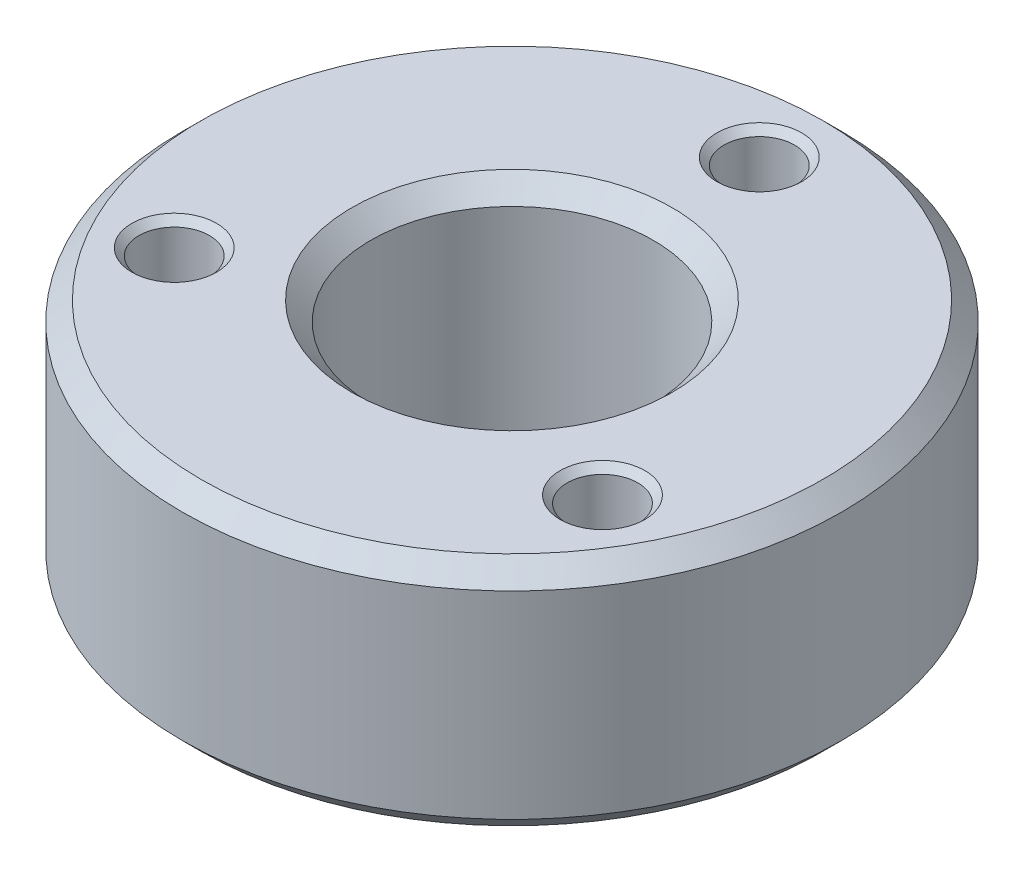
ISO-10303-21;
HEADER;
FILE_DESCRIPTION(('STEP AP214'),'2;1');
FILE_NAME('part.step','',(''),(''),'','','');
FILE_SCHEMA(('AUTOMOTIVE_DESIGN { 1 0 10303 214 1 1 1 1 }'));
ENDSEC;
DATA;
#1=APPLICATION_CONTEXT('core data for automotive mechanical design processes');
#2=APPLICATION_PROTOCOL_DEFINITION('international standard','automotive_design',2000,#1);
#3=PRODUCT_CONTEXT('',#1,'mechanical');
#4=PRODUCT('Part','Part','',(#3));
#5=PRODUCT_RELATED_PRODUCT_CATEGORY('part','',(#4));
#6=PRODUCT_DEFINITION_FORMATION('','',#4);
#7=PRODUCT_DEFINITION_CONTEXT('part definition',#1,'design');
#8=PRODUCT_DEFINITION('design','',#6,#7);
#9=PRODUCT_DEFINITION_SHAPE('','',#8);
#10=(LENGTH_UNIT() NAMED_UNIT(*) SI_UNIT(.MILLI.,.METRE.));
#11=(NAMED_UNIT(*) PLANE_ANGLE_UNIT() SI_UNIT($,.RADIAN.));
#12=(NAMED_UNIT(*) SI_UNIT($,.STERADIAN.) SOLID_ANGLE_UNIT());
#13=UNCERTAINTY_MEASURE_WITH_UNIT(LENGTH_MEASURE(1.E-05),#10,'distance_accuracy_value','');
#14=(GEOMETRIC_REPRESENTATION_CONTEXT(3) GLOBAL_UNCERTAINTY_ASSIGNED_CONTEXT((#13)) GLOBAL_UNIT_ASSIGNED_CONTEXT((#10,
#11,#12)) REPRESENTATION_CONTEXT('',''));
#15=CARTESIAN_POINT('',(0.,0.,0.));
#16=DIRECTION('',(0.,0.,1.));
#17=DIRECTION('',(1.,0.,0.));
#18=AXIS2_PLACEMENT_3D('',#15,#16,#17);
#19=CARTESIAN_POINT('',(0.,10.,0.));
#20=DIRECTION('',(0.,-1.,0.));
#21=DIRECTION('',(0.,0.,-1.));
#22=AXIS2_PLACEMENT_3D('',#19,#20,#21);
#23=CYLINDRICAL_SURFACE('',#22,14.);
#24=CARTESIAN_POINT('',(0.,0.800000000000006,0.));
#25=DIRECTION('',(0.,1.,0.));
#26=DIRECTION('',(0.,0.,1.));
#27=AXIS2_PLACEMENT_3D('',#24,#25,#26);
#28=CIRCLE('',#27,14.);
#29=CARTESIAN_POINT('',(0.,0.800000000000006,14.));
#30=VERTEX_POINT('',#29);
#31=EDGE_CURVE('E123',#30,#30,#28,.T.);
#32=ORIENTED_EDGE('',*,*,#31,.T.);
#33=EDGE_LOOP('',(#32));
#34=FACE_BOUND('',#33,.T.);
#35=CARTESIAN_POINT('',(0.,9.19999999999999,0.));
#36=DIRECTION('',(0.,1.,0.));
#37=DIRECTION('',(0.,0.,1.));
#38=AXIS2_PLACEMENT_3D('',#35,#36,#37);
#39=CIRCLE('',#38,14.);
#40=CARTESIAN_POINT('',(0.,9.19999999999999,14.));
#41=VERTEX_POINT('',#40);
#42=EDGE_CURVE('E127',#41,#41,#39,.F.);
#43=ORIENTED_EDGE('',*,*,#42,.T.);
#44=EDGE_LOOP('',(#43));
#45=FACE_BOUND('',#44,.T.);
#46=ADVANCED_FACE('F42',(#34,#45),#23,.T.);
#47=CARTESIAN_POINT('',(0.,10.,0.));
#48=DIRECTION('',(0.,1.,0.));
#49=DIRECTION('',(0.,0.,1.));
#50=AXIS2_PLACEMENT_3D('',#47,#48,#49);
#51=PLANE('',#50);
#52=CARTESIAN_POINT('',(-9.09326673973665,10.,5.24999999999992));
#53=DIRECTION('',(0.,1.,0.));
#54=DIRECTION('',(0.,0.,1.));
#55=AXIS2_PLACEMENT_3D('',#52,#53,#54);
#56=CIRCLE('',#55,1.79999999999999);
#57=CARTESIAN_POINT('',(-9.09326673973665,10.,7.04999999999991));
#58=VERTEX_POINT('',#57);
#59=EDGE_CURVE('E10',#58,#58,#56,.F.);
#60=ORIENTED_EDGE('',*,*,#59,.T.);
#61=EDGE_LOOP('',(#60));
#62=FACE_BOUND('',#61,.T.);
#63=CARTESIAN_POINT('',(9.09326673973658,10.,5.25000000000004));
#64=DIRECTION('',(0.,1.,0.));
#65=DIRECTION('',(0.,0.,1.));
#66=AXIS2_PLACEMENT_3D('',#63,#64,#65);
#67=CIRCLE('',#66,1.79999999999999);
#68=CARTESIAN_POINT('',(9.09326673973658,10.,7.05000000000003));
#69=VERTEX_POINT('',#68);
#70=EDGE_CURVE('E67',#69,#69,#67,.F.);
#71=ORIENTED_EDGE('',*,*,#70,.T.);
#72=EDGE_LOOP('',(#71));
#73=FACE_BOUND('',#72,.T.);
#74=CARTESIAN_POINT('',(0.,10.,-10.5));
#75=DIRECTION('',(0.,1.,0.));
#76=DIRECTION('',(0.,0.,1.));
#77=AXIS2_PLACEMENT_3D('',#74,#75,#76);
#78=CIRCLE('',#77,1.8);
#79=CARTESIAN_POINT('',(0.,10.,-8.7));
#80=VERTEX_POINT('',#79);
#81=EDGE_CURVE('E83',#80,#80,#78,.F.);
#82=ORIENTED_EDGE('',*,*,#81,.T.);
#83=EDGE_LOOP('',(#82));
#84=FACE_BOUND('',#83,.T.);
#85=CARTESIAN_POINT('',(0.,10.,0.));
#86=DIRECTION('',(0.,1.,0.));
#87=DIRECTION('',(0.,0.,1.));
#88=AXIS2_PLACEMENT_3D('',#85,#86,#87);
#89=CIRCLE('',#88,13.2);
#90=CARTESIAN_POINT('',(0.,10.,13.2));
#91=VERTEX_POINT('',#90);
#92=EDGE_CURVE('E99',#91,#91,#89,.T.);
#93=ORIENTED_EDGE('',*,*,#92,.T.);
#94=EDGE_LOOP('',(#93));
#95=FACE_BOUND('',#94,.T.);
#96=CARTESIAN_POINT('',(0.,10.,0.));
#97=DIRECTION('',(0.,1.,0.));
#98=DIRECTION('',(0.,0.,1.));
#99=AXIS2_PLACEMENT_3D('',#96,#97,#98);
#100=CIRCLE('',#99,6.8);
#101=CARTESIAN_POINT('',(0.,10.,6.8));
#102=VERTEX_POINT('',#101);
#103=EDGE_CURVE('E103',#102,#102,#100,.F.);
#104=ORIENTED_EDGE('',*,*,#103,.T.);
#105=EDGE_LOOP('',(#104));
#106=FACE_BOUND('',#105,.T.);
#107=ADVANCED_FACE('F141',(#62,#73,#84,#95,#106),#51,.T.);
#108=CARTESIAN_POINT('',(0.,0.,0.));
#109=DIRECTION('',(0.,1.,0.));
#110=DIRECTION('',(0.,0.,1.));
#111=AXIS2_PLACEMENT_3D('',#108,#109,#110);
#112=PLANE('',#111);
#113=CARTESIAN_POINT('',(-9.09326673973665,0.,5.24999999999992));
#114=DIRECTION('',(0.,1.,0.));
#115=DIRECTION('',(0.,0.,1.));
#116=AXIS2_PLACEMENT_3D('',#113,#114,#115);
#117=CIRCLE('',#116,1.8);
#118=CARTESIAN_POINT('',(-9.09326673973665,0.,7.04999999999992));
#119=VERTEX_POINT('',#118);
#120=EDGE_CURVE('E61',#119,#119,#117,.T.);
#121=ORIENTED_EDGE('',*,*,#120,.T.);
#122=EDGE_LOOP('',(#121));
#123=FACE_BOUND('',#122,.T.);
#124=CARTESIAN_POINT('',(9.09326673973658,0.,5.25000000000004));
#125=DIRECTION('',(0.,1.,0.));
#126=DIRECTION('',(0.,0.,1.));
#127=AXIS2_PLACEMENT_3D('',#124,#125,#126);
#128=CIRCLE('',#127,1.8);
#129=CARTESIAN_POINT('',(9.09326673973658,0.,7.05000000000004));
#130=VERTEX_POINT('',#129);
#131=EDGE_CURVE('E79',#130,#130,#128,.T.);
#132=ORIENTED_EDGE('',*,*,#131,.T.);
#133=EDGE_LOOP('',(#132));
#134=FACE_BOUND('',#133,.T.);
#135=CARTESIAN_POINT('',(0.,0.,-10.5));
#136=DIRECTION('',(0.,1.,0.));
#137=DIRECTION('',(0.,0.,1.));
#138=AXIS2_PLACEMENT_3D('',#135,#136,#137);
#139=CIRCLE('',#138,1.8);
#140=CARTESIAN_POINT('',(0.,0.,-8.7));
#141=VERTEX_POINT('',#140);
#142=EDGE_CURVE('E95',#141,#141,#139,.T.);
#143=ORIENTED_EDGE('',*,*,#142,.T.);
#144=EDGE_LOOP('',(#143));
#145=FACE_BOUND('',#144,.T.);
#146=CARTESIAN_POINT('',(0.,0.,0.));
#147=DIRECTION('',(0.,1.,0.));
#148=DIRECTION('',(0.,0.,1.));
#149=AXIS2_PLACEMENT_3D('',#146,#147,#148);
#150=CIRCLE('',#149,13.2);
#151=CARTESIAN_POINT('',(0.,0.,13.2));
#152=VERTEX_POINT('',#151);
#153=EDGE_CURVE('E115',#152,#152,#150,.F.);
#154=ORIENTED_EDGE('',*,*,#153,.T.);
#155=EDGE_LOOP('',(#154));
#156=FACE_BOUND('',#155,.T.);
#157=CARTESIAN_POINT('',(0.,0.,0.));
#158=DIRECTION('',(0.,1.,0.));
#159=DIRECTION('',(0.,0.,1.));
#160=AXIS2_PLACEMENT_3D('',#157,#158,#159);
#161=CIRCLE('',#160,6.8);
#162=CARTESIAN_POINT('',(0.,0.,6.8));
#163=VERTEX_POINT('',#162);
#164=EDGE_CURVE('E119',#163,#163,#161,.T.);
#165=ORIENTED_EDGE('',*,*,#164,.T.);
#166=EDGE_LOOP('',(#165));
#167=FACE_BOUND('',#166,.T.);
#168=ADVANCED_FACE('F144',(#123,#134,#145,#156,#167),#112,.F.);
#169=CARTESIAN_POINT('',(0.,0.,0.));
#170=DIRECTION('',(0.,1.,0.));
#171=DIRECTION('',(0.,0.,1.));
#172=AXIS2_PLACEMENT_3D('',#169,#170,#171);
#173=CYLINDRICAL_SURFACE('',#172,6.);
#174=CARTESIAN_POINT('',(0.,0.799999999999992,0.));
#175=DIRECTION('',(0.,1.,0.));
#176=DIRECTION('',(0.,0.,1.));
#177=AXIS2_PLACEMENT_3D('',#174,#175,#176);
#178=CIRCLE('',#177,6.);
#179=CARTESIAN_POINT('',(0.,0.799999999999992,6.));
#180=VERTEX_POINT('',#179);
#181=EDGE_CURVE('E107',#180,#180,#178,.F.);
#182=ORIENTED_EDGE('',*,*,#181,.T.);
#183=EDGE_LOOP('',(#182));
#184=FACE_BOUND('',#183,.T.);
#185=CARTESIAN_POINT('',(0.,9.19999999999999,0.));
#186=DIRECTION('',(0.,1.,0.));
#187=DIRECTION('',(0.,0.,1.));
#188=AXIS2_PLACEMENT_3D('',#185,#186,#187);
#189=CIRCLE('',#188,6.);
#190=CARTESIAN_POINT('',(0.,9.19999999999999,6.));
#191=VERTEX_POINT('',#190);
#192=EDGE_CURVE('E111',#191,#191,#189,.T.);
#193=ORIENTED_EDGE('',*,*,#192,.T.);
#194=EDGE_LOOP('',(#193));
#195=FACE_BOUND('',#194,.T.);
#196=ADVANCED_FACE('F154',(#184,#195),#173,.F.);
#197=CARTESIAN_POINT('',(0.,0.,-10.5));
#198=DIRECTION('',(0.,1.,0.));
#199=DIRECTION('',(0.,0.,1.));
#200=AXIS2_PLACEMENT_3D('',#197,#198,#199);
#201=CYLINDRICAL_SURFACE('',#200,1.5);
#202=CARTESIAN_POINT('',(0.,0.299999999999999,-10.5));
#203=DIRECTION('',(0.,1.,0.));
#204=DIRECTION('',(0.,0.,1.));
#205=AXIS2_PLACEMENT_3D('',#202,#203,#204);
#206=CIRCLE('',#205,1.5);
#207=CARTESIAN_POINT('',(0.,0.299999999999999,-9.));
#208=VERTEX_POINT('',#207);
#209=EDGE_CURVE('E87',#208,#208,#206,.F.);
#210=ORIENTED_EDGE('',*,*,#209,.T.);
#211=EDGE_LOOP('',(#210));
#212=FACE_BOUND('',#211,.T.);
#213=CARTESIAN_POINT('',(0.,9.7,-10.5));
#214=DIRECTION('',(0.,1.,0.));
#215=DIRECTION('',(0.,0.,1.));
#216=AXIS2_PLACEMENT_3D('',#213,#214,#215);
#217=CIRCLE('',#216,1.5);
#218=CARTESIAN_POINT('',(0.,9.7,-9.));
#219=VERTEX_POINT('',#218);
#220=EDGE_CURVE('E91',#219,#219,#217,.T.);
#221=ORIENTED_EDGE('',*,*,#220,.T.);
#222=EDGE_LOOP('',(#221));
#223=FACE_BOUND('',#222,.T.);
#224=ADVANCED_FACE('F156',(#212,#223),#201,.F.);
#225=CARTESIAN_POINT('',(0.,0.800000000000006,0.));
#226=DIRECTION('',(0.,1.,0.));
#227=DIRECTION('',(0.,0.,1.));
#228=AXIS2_PLACEMENT_3D('',#225,#226,#227);
#229=CONICAL_SURFACE('',#228,14.,0.785398163397448);
#230=ORIENTED_EDGE('',*,*,#153,.F.);
#231=EDGE_LOOP('',(#230));
#232=FACE_BOUND('',#231,.T.);
#233=ORIENTED_EDGE('',*,*,#31,.F.);
#234=EDGE_LOOP('',(#233));
#235=FACE_BOUND('',#234,.T.);
#236=ADVANCED_FACE('F163',(#232,#235),#229,.T.);
#237=CARTESIAN_POINT('',(0.,0.,0.));
#238=DIRECTION('',(0.,-1.,0.));
#239=DIRECTION('',(0.,0.,-1.));
#240=AXIS2_PLACEMENT_3D('',#237,#238,#239);
#241=CONICAL_SURFACE('',#240,6.8,0.78539816339745);
#242=ORIENTED_EDGE('',*,*,#181,.F.);
#243=EDGE_LOOP('',(#242));
#244=FACE_BOUND('',#243,.T.);
#245=ORIENTED_EDGE('',*,*,#164,.F.);
#246=EDGE_LOOP('',(#245));
#247=FACE_BOUND('',#246,.T.);
#248=ADVANCED_FACE('F137',(#244,#247),#241,.F.);
#249=CARTESIAN_POINT('',(0.,10.,0.));
#250=DIRECTION('',(0.,-1.,0.));
#251=DIRECTION('',(0.,0.,-1.));
#252=AXIS2_PLACEMENT_3D('',#249,#250,#251);
#253=CONICAL_SURFACE('',#252,13.2,0.785398163397448);
#254=ORIENTED_EDGE('',*,*,#42,.F.);
#255=EDGE_LOOP('',(#254));
#256=FACE_BOUND('',#255,.T.);
#257=ORIENTED_EDGE('',*,*,#92,.F.);
#258=EDGE_LOOP('',(#257));
#259=FACE_BOUND('',#258,.T.);
#260=ADVANCED_FACE('F133',(#256,#259),#253,.T.);
#261=CARTESIAN_POINT('',(0.,9.19999999999999,0.));
#262=DIRECTION('',(0.,1.,0.));
#263=DIRECTION('',(0.,0.,1.));
#264=AXIS2_PLACEMENT_3D('',#261,#262,#263);
#265=CONICAL_SURFACE('',#264,6.,0.785398163397445);
#266=ORIENTED_EDGE('',*,*,#103,.F.);
#267=EDGE_LOOP('',(#266));
#268=FACE_BOUND('',#267,.T.);
#269=ORIENTED_EDGE('',*,*,#192,.F.);
#270=EDGE_LOOP('',(#269));
#271=FACE_BOUND('',#270,.T.);
#272=ADVANCED_FACE('F136',(#268,#271),#265,.F.);
#273=CARTESIAN_POINT('',(0.,0.,-10.5));
#274=DIRECTION('',(0.,-1.,0.));
#275=DIRECTION('',(0.,0.,-1.));
#276=AXIS2_PLACEMENT_3D('',#273,#274,#275);
#277=CONICAL_SURFACE('',#276,1.8,0.785398163397449);
#278=ORIENTED_EDGE('',*,*,#209,.F.);
#279=EDGE_LOOP('',(#278));
#280=FACE_BOUND('',#279,.T.);
#281=ORIENTED_EDGE('',*,*,#142,.F.);
#282=EDGE_LOOP('',(#281));
#283=FACE_BOUND('',#282,.T.);
#284=ADVANCED_FACE('F150',(#280,#283),#277,.F.);
#285=CARTESIAN_POINT('',(0.,9.7,-10.5));
#286=DIRECTION('',(0.,1.,0.));
#287=DIRECTION('',(0.,0.,1.));
#288=AXIS2_PLACEMENT_3D('',#285,#286,#287);
#289=CONICAL_SURFACE('',#288,1.5,0.785398163397448);
#290=ORIENTED_EDGE('',*,*,#81,.F.);
#291=EDGE_LOOP('',(#290));
#292=FACE_BOUND('',#291,.T.);
#293=ORIENTED_EDGE('',*,*,#220,.F.);
#294=EDGE_LOOP('',(#293));
#295=FACE_BOUND('',#294,.T.);
#296=ADVANCED_FACE('F199',(#292,#295),#289,.F.);
#297=CARTESIAN_POINT('',(-9.09326673973665,0.,5.24999999999992));
#298=DIRECTION('',(0.,1.,0.));
#299=DIRECTION('',(0.,0.,1.));
#300=AXIS2_PLACEMENT_3D('',#297,#298,#299);
#301=CYLINDRICAL_SURFACE('',#300,1.5);
#302=CARTESIAN_POINT('',(-9.09326673973665,0.299999999999996,5.24999999999992));
#303=DIRECTION('',(0.,1.,0.));
#304=DIRECTION('',(0.,0.,1.));
#305=AXIS2_PLACEMENT_3D('',#302,#303,#304);
#306=CIRCLE('',#305,1.5);
#307=CARTESIAN_POINT('',(-9.09326673973665,0.299999999999996,6.74999999999992));
#308=VERTEX_POINT('',#307);
#309=EDGE_CURVE('E51',#308,#308,#306,.F.);
#310=ORIENTED_EDGE('',*,*,#309,.T.);
#311=EDGE_LOOP('',(#310));
#312=FACE_BOUND('',#311,.T.);
#313=CARTESIAN_POINT('',(-9.09326673973665,9.70000000000001,5.24999999999992));
#314=DIRECTION('',(0.,1.,0.));
#315=DIRECTION('',(0.,0.,1.));
#316=AXIS2_PLACEMENT_3D('',#313,#314,#315);
#317=CIRCLE('',#316,1.5);
#318=CARTESIAN_POINT('',(-9.09326673973665,9.70000000000001,6.74999999999992));
#319=VERTEX_POINT('',#318);
#320=EDGE_CURVE('E56',#319,#319,#317,.T.);
#321=ORIENTED_EDGE('',*,*,#320,.T.);
#322=EDGE_LOOP('',(#321));
#323=FACE_BOUND('',#322,.T.);
#324=ADVANCED_FACE('F206',(#312,#323),#301,.F.);
#325=CARTESIAN_POINT('',(9.09326673973658,0.,5.25000000000004));
#326=DIRECTION('',(0.,1.,0.));
#327=DIRECTION('',(0.,0.,1.));
#328=AXIS2_PLACEMENT_3D('',#325,#326,#327);
#329=CYLINDRICAL_SURFACE('',#328,1.5);
#330=CARTESIAN_POINT('',(9.09326673973658,0.3,5.25000000000004));
#331=DIRECTION('',(0.,1.,0.));
#332=DIRECTION('',(0.,0.,1.));
#333=AXIS2_PLACEMENT_3D('',#330,#331,#332);
#334=CIRCLE('',#333,1.5);
#335=CARTESIAN_POINT('',(9.09326673973658,0.3,6.75000000000004));
#336=VERTEX_POINT('',#335);
#337=EDGE_CURVE('E71',#336,#336,#334,.F.);
#338=ORIENTED_EDGE('',*,*,#337,.T.);
#339=EDGE_LOOP('',(#338));
#340=FACE_BOUND('',#339,.T.);
#341=CARTESIAN_POINT('',(9.09326673973658,9.70000000000001,5.25000000000004));
#342=DIRECTION('',(0.,1.,0.));
#343=DIRECTION('',(0.,0.,1.));
#344=AXIS2_PLACEMENT_3D('',#341,#342,#343);
#345=CIRCLE('',#344,1.5);
#346=CARTESIAN_POINT('',(9.09326673973658,9.70000000000001,6.75000000000004));
#347=VERTEX_POINT('',#346);
#348=EDGE_CURVE('E75',#347,#347,#345,.T.);
#349=ORIENTED_EDGE('',*,*,#348,.T.);
#350=EDGE_LOOP('',(#349));
#351=FACE_BOUND('',#350,.T.);
#352=ADVANCED_FACE('F215',(#340,#351),#329,.F.);
#353=CARTESIAN_POINT('',(9.09326673973658,0.,5.25000000000004));
#354=DIRECTION('',(0.,-1.,0.));
#355=DIRECTION('',(0.,0.,-1.));
#356=AXIS2_PLACEMENT_3D('',#353,#354,#355);
#357=CONICAL_SURFACE('',#356,1.8,0.785398163397448);
#358=ORIENTED_EDGE('',*,*,#337,.F.);
#359=EDGE_LOOP('',(#358));
#360=FACE_BOUND('',#359,.T.);
#361=ORIENTED_EDGE('',*,*,#131,.F.);
#362=EDGE_LOOP('',(#361));
#363=FACE_BOUND('',#362,.T.);
#364=ADVANCED_FACE('F208',(#360,#363),#357,.F.);
#365=CARTESIAN_POINT('',(9.09326673973658,9.70000000000001,5.25000000000004));
#366=DIRECTION('',(0.,1.,0.));
#367=DIRECTION('',(0.,0.,1.));
#368=AXIS2_PLACEMENT_3D('',#365,#366,#367);
#369=CONICAL_SURFACE('',#368,1.5,0.78539816339745);
#370=ORIENTED_EDGE('',*,*,#70,.F.);
#371=EDGE_LOOP('',(#370));
#372=FACE_BOUND('',#371,.T.);
#373=ORIENTED_EDGE('',*,*,#348,.F.);
#374=EDGE_LOOP('',(#373));
#375=FACE_BOUND('',#374,.T.);
#376=ADVANCED_FACE('F214',(#372,#375),#369,.F.);
#377=CARTESIAN_POINT('',(-9.09326673973665,0.,5.24999999999992));
#378=DIRECTION('',(0.,-1.,0.));
#379=DIRECTION('',(0.,0.,-1.));
#380=AXIS2_PLACEMENT_3D('',#377,#378,#379);
#381=CONICAL_SURFACE('',#380,1.8,0.785398163397451);
#382=ORIENTED_EDGE('',*,*,#309,.F.);
#383=EDGE_LOOP('',(#382));
#384=FACE_BOUND('',#383,.T.);
#385=ORIENTED_EDGE('',*,*,#120,.F.);
#386=EDGE_LOOP('',(#385));
#387=FACE_BOUND('',#386,.T.);
#388=ADVANCED_FACE('F221',(#384,#387),#381,.F.);
#389=CARTESIAN_POINT('',(-9.09326673973665,9.70000000000001,5.24999999999992));
#390=DIRECTION('',(0.,1.,0.));
#391=DIRECTION('',(0.,0.,1.));
#392=AXIS2_PLACEMENT_3D('',#389,#390,#391);
#393=CONICAL_SURFACE('',#392,1.5,0.78539816339745);
#394=ORIENTED_EDGE('',*,*,#59,.F.);
#395=EDGE_LOOP('',(#394));
#396=FACE_BOUND('',#395,.T.);
#397=ORIENTED_EDGE('',*,*,#320,.F.);
#398=EDGE_LOOP('',(#397));
#399=FACE_BOUND('',#398,.T.);
#400=ADVANCED_FACE('F45',(#396,#399),#393,.F.);
#401=CLOSED_SHELL('',(#46,#107,#168,#196,#224,#236,#248,#260,#272,#284,#296,#324,#352,#364,#376,
#388,#400));
#402=MANIFOLD_SOLID_BREP('B2',#401);
#403=ADVANCED_BREP_SHAPE_REPRESENTATION('',(#18,#402),#14);
#404=SHAPE_DEFINITION_REPRESENTATION(#9,#403);
ENDSEC;
END-ISO-10303-21;
